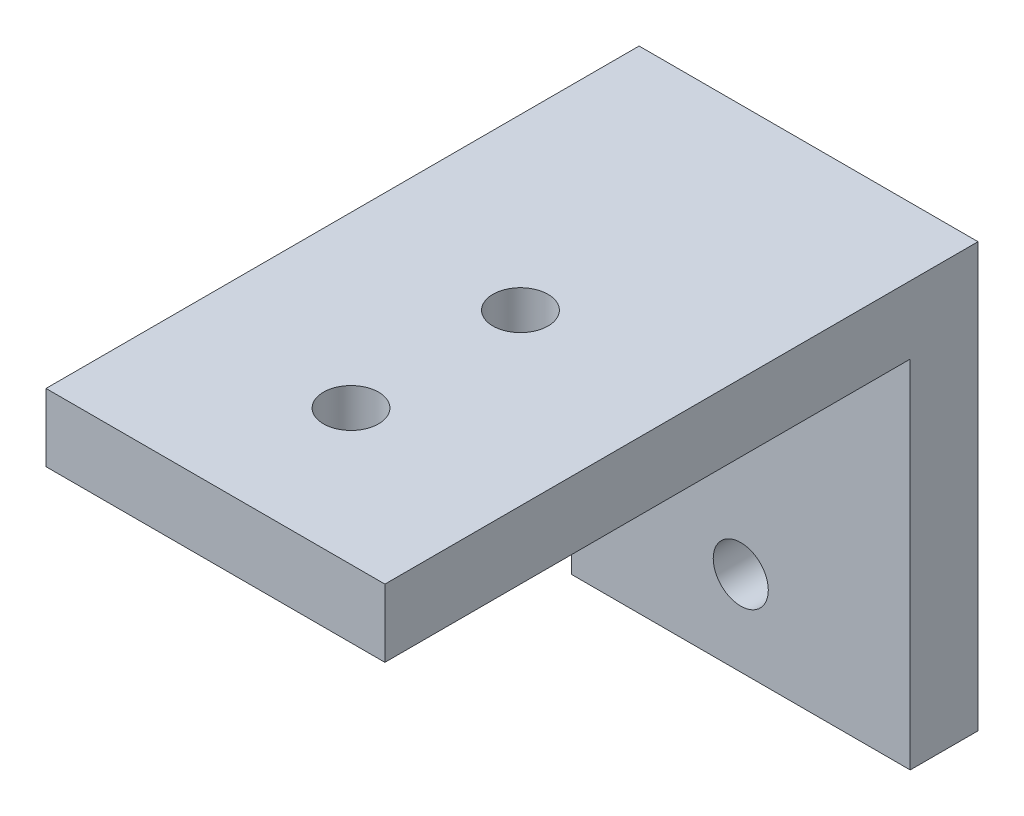
ISO-10303-21;
HEADER;
FILE_DESCRIPTION(('STEP AP214'),'2;1');
FILE_NAME('part.step','',(''),(''),'','','');
FILE_SCHEMA(('AUTOMOTIVE_DESIGN { 1 0 10303 214 1 1 1 1 }'));
ENDSEC;
DATA;
#1=APPLICATION_CONTEXT('core data for automotive mechanical design processes');
#2=APPLICATION_PROTOCOL_DEFINITION('international standard','automotive_design',2000,#1);
#3=PRODUCT_CONTEXT('',#1,'mechanical');
#4=PRODUCT('Part','Part','',(#3));
#5=PRODUCT_RELATED_PRODUCT_CATEGORY('part','',(#4));
#6=PRODUCT_DEFINITION_FORMATION('','',#4);
#7=PRODUCT_DEFINITION_CONTEXT('part definition',#1,'design');
#8=PRODUCT_DEFINITION('design','',#6,#7);
#9=PRODUCT_DEFINITION_SHAPE('','',#8);
#10=(LENGTH_UNIT() NAMED_UNIT(*) SI_UNIT(.MILLI.,.METRE.));
#11=(NAMED_UNIT(*) PLANE_ANGLE_UNIT() SI_UNIT($,.RADIAN.));
#12=(NAMED_UNIT(*) SI_UNIT($,.STERADIAN.) SOLID_ANGLE_UNIT());
#13=UNCERTAINTY_MEASURE_WITH_UNIT(LENGTH_MEASURE(1.E-05),#10,'distance_accuracy_value','');
#14=(GEOMETRIC_REPRESENTATION_CONTEXT(3) GLOBAL_UNCERTAINTY_ASSIGNED_CONTEXT((#13)) GLOBAL_UNIT_ASSIGNED_CONTEXT((#10,
#11,#12)) REPRESENTATION_CONTEXT('',''));
#15=CARTESIAN_POINT('',(0.,0.,0.));
#16=DIRECTION('',(0.,0.,1.));
#17=DIRECTION('',(1.,0.,0.));
#18=AXIS2_PLACEMENT_3D('',#15,#16,#17);
#19=CARTESIAN_POINT('',(0.,0.,8.));
#20=DIRECTION('',(0.,0.,1.));
#21=DIRECTION('',(1.,0.,0.));
#22=AXIS2_PLACEMENT_3D('',#19,#20,#21);
#23=PLANE('',#22);
#24=CARTESIAN_POINT('',(0.,-20.,8.));
#25=DIRECTION('',(0.,0.,1.));
#26=DIRECTION('',(1.,0.,0.));
#27=AXIS2_PLACEMENT_3D('',#24,#25,#26);
#28=CIRCLE('',#27,3.25);
#29=CARTESIAN_POINT('',(3.25,-20.,8.));
#30=VERTEX_POINT('',#29);
#31=EDGE_CURVE('E121',#30,#30,#28,.T.);
#32=ORIENTED_EDGE('',*,*,#31,.F.);
#33=EDGE_LOOP('',(#32));
#34=FACE_BOUND('',#33,.T.);
#35=CARTESIAN_POINT('',(0.,-40.,8.));
#36=DIRECTION('',(0.,0.,1.));
#37=DIRECTION('',(1.,0.,0.));
#38=AXIS2_PLACEMENT_3D('',#35,#36,#37);
#39=CIRCLE('',#38,3.25);
#40=CARTESIAN_POINT('',(3.25,-40.,8.));
#41=VERTEX_POINT('',#40);
#42=EDGE_CURVE('E288',#41,#41,#39,.T.);
#43=ORIENTED_EDGE('',*,*,#42,.F.);
#44=EDGE_LOOP('',(#43));
#45=FACE_BOUND('',#44,.T.);
#46=DIRECTION('',(0.,1.,0.));
#47=VECTOR('',#46,1.);
#48=CARTESIAN_POINT('',(20.,-50.,8.));
#49=LINE('',#48,#47);
#50=CARTESIAN_POINT('',(20.,-50.,8.));
#51=VERTEX_POINT('',#50);
#52=CARTESIAN_POINT('',(20.,-8.,8.));
#53=VERTEX_POINT('',#52);
#54=EDGE_CURVE('E63',#51,#53,#49,.T.);
#55=ORIENTED_EDGE('',*,*,#54,.T.);
#56=DIRECTION('',(-1.,0.,0.));
#57=VECTOR('',#56,1.);
#58=CARTESIAN_POINT('',(0.,-8.,8.));
#59=LINE('',#58,#57);
#60=CARTESIAN_POINT('',(-20.,-8.,8.));
#61=VERTEX_POINT('',#60);
#62=EDGE_CURVE('E67',#53,#61,#59,.T.);
#63=ORIENTED_EDGE('',*,*,#62,.T.);
#64=DIRECTION('',(0.,-1.,0.));
#65=VECTOR('',#64,1.);
#66=CARTESIAN_POINT('',(-20.,0.,8.));
#67=LINE('',#66,#65);
#68=CARTESIAN_POINT('',(-20.,-50.,8.));
#69=VERTEX_POINT('',#68);
#70=EDGE_CURVE('E124',#61,#69,#67,.T.);
#71=ORIENTED_EDGE('',*,*,#70,.T.);
#72=DIRECTION('',(1.,0.,0.));
#73=VECTOR('',#72,1.);
#74=CARTESIAN_POINT('',(-20.,-50.,8.));
#75=LINE('',#74,#73);
#76=EDGE_CURVE('E136',#69,#51,#75,.T.);
#77=ORIENTED_EDGE('',*,*,#76,.T.);
#78=EDGE_LOOP('',(#55,#63,#71,#77));
#79=FACE_BOUND('',#78,.T.);
#80=ADVANCED_FACE('F47',(#34,#45,#79),#23,.T.);
#81=CARTESIAN_POINT('',(-20.,0.,8.));
#82=DIRECTION('',(1.,0.,0.));
#83=DIRECTION('',(0.,0.,-1.));
#84=AXIS2_PLACEMENT_3D('',#81,#82,#83);
#85=PLANE('',#84);
#86=DIRECTION('',(0.,-1.,0.));
#87=VECTOR('',#86,1.);
#88=CARTESIAN_POINT('',(-20.,0.,0.));
#89=LINE('',#88,#87);
#90=CARTESIAN_POINT('',(-20.,0.,0.));
#91=VERTEX_POINT('',#90);
#92=CARTESIAN_POINT('',(-20.,-50.,0.));
#93=VERTEX_POINT('',#92);
#94=EDGE_CURVE('E129',#91,#93,#89,.T.);
#95=ORIENTED_EDGE('',*,*,#94,.T.);
#96=DIRECTION('',(0.,0.,-1.));
#97=VECTOR('',#96,1.);
#98=CARTESIAN_POINT('',(-20.,-50.,8.));
#99=LINE('',#98,#97);
#100=EDGE_CURVE('E11',#69,#93,#99,.T.);
#101=ORIENTED_EDGE('',*,*,#100,.F.);
#102=ORIENTED_EDGE('',*,*,#70,.F.);
#103=DIRECTION('',(0.,0.,-1.));
#104=VECTOR('',#103,1.);
#105=CARTESIAN_POINT('',(-20.,-8.,70.));
#106=LINE('',#105,#104);
#107=CARTESIAN_POINT('',(-20.,-8.,70.));
#108=VERTEX_POINT('',#107);
#109=EDGE_CURVE('E103',#108,#61,#106,.T.);
#110=ORIENTED_EDGE('',*,*,#109,.F.);
#111=DIRECTION('',(0.,-1.,0.));
#112=VECTOR('',#111,1.);
#113=CARTESIAN_POINT('',(-20.,0.,70.));
#114=LINE('',#113,#112);
#115=CARTESIAN_POINT('',(-20.,0.,70.));
#116=VERTEX_POINT('',#115);
#117=EDGE_CURVE('E111',#116,#108,#114,.T.);
#118=ORIENTED_EDGE('',*,*,#117,.F.);
#119=DIRECTION('',(0.,0.,-1.));
#120=VECTOR('',#119,1.);
#121=CARTESIAN_POINT('',(-20.,0.,8.));
#122=LINE('',#121,#120);
#123=EDGE_CURVE('E142',#116,#91,#122,.T.);
#124=ORIENTED_EDGE('',*,*,#123,.T.);
#125=EDGE_LOOP('',(#95,#101,#102,#110,#118,#124));
#126=FACE_BOUND('',#125,.T.);
#127=ADVANCED_FACE('F49',(#126),#85,.F.);
#128=CARTESIAN_POINT('',(-20.,-50.,8.));
#129=DIRECTION('',(0.,1.,0.));
#130=DIRECTION('',(0.,0.,1.));
#131=AXIS2_PLACEMENT_3D('',#128,#129,#130);
#132=PLANE('',#131);
#133=DIRECTION('',(1.,0.,0.));
#134=VECTOR('',#133,1.);
#135=CARTESIAN_POINT('',(-20.,-50.,0.));
#136=LINE('',#135,#134);
#137=CARTESIAN_POINT('',(20.,-50.,0.));
#138=VERTEX_POINT('',#137);
#139=EDGE_CURVE('E145',#93,#138,#136,.T.);
#140=ORIENTED_EDGE('',*,*,#139,.T.);
#141=DIRECTION('',(0.,0.,-1.));
#142=VECTOR('',#141,1.);
#143=CARTESIAN_POINT('',(20.,-50.,8.));
#144=LINE('',#143,#142);
#145=EDGE_CURVE('E56',#51,#138,#144,.T.);
#146=ORIENTED_EDGE('',*,*,#145,.F.);
#147=ORIENTED_EDGE('',*,*,#76,.F.);
#148=ORIENTED_EDGE('',*,*,#100,.T.);
#149=EDGE_LOOP('',(#140,#146,#147,#148));
#150=FACE_BOUND('',#149,.T.);
#151=ADVANCED_FACE('F173',(#150),#132,.F.);
#152=CARTESIAN_POINT('',(20.,-50.,8.));
#153=DIRECTION('',(-1.,0.,0.));
#154=DIRECTION('',(0.,0.,1.));
#155=AXIS2_PLACEMENT_3D('',#152,#153,#154);
#156=PLANE('',#155);
#157=DIRECTION('',(0.,0.,-1.));
#158=VECTOR('',#157,1.);
#159=CARTESIAN_POINT('',(20.,0.,8.));
#160=LINE('',#159,#158);
#161=CARTESIAN_POINT('',(20.,0.,70.));
#162=VERTEX_POINT('',#161);
#163=CARTESIAN_POINT('',(20.,0.,0.));
#164=VERTEX_POINT('',#163);
#165=EDGE_CURVE('E155',#162,#164,#160,.T.);
#166=ORIENTED_EDGE('',*,*,#165,.F.);
#167=DIRECTION('',(0.,1.,0.));
#168=VECTOR('',#167,1.);
#169=CARTESIAN_POINT('',(20.,-8.,70.));
#170=LINE('',#169,#168);
#171=CARTESIAN_POINT('',(20.,-8.,70.));
#172=VERTEX_POINT('',#171);
#173=EDGE_CURVE('E110',#172,#162,#170,.T.);
#174=ORIENTED_EDGE('',*,*,#173,.F.);
#175=DIRECTION('',(0.,0.,-1.));
#176=VECTOR('',#175,1.);
#177=CARTESIAN_POINT('',(20.,-8.,70.));
#178=LINE('',#177,#176);
#179=EDGE_CURVE('E105',#172,#53,#178,.T.);
#180=ORIENTED_EDGE('',*,*,#179,.T.);
#181=ORIENTED_EDGE('',*,*,#54,.F.);
#182=ORIENTED_EDGE('',*,*,#145,.T.);
#183=DIRECTION('',(0.,1.,0.));
#184=VECTOR('',#183,1.);
#185=CARTESIAN_POINT('',(20.,-50.,0.));
#186=LINE('',#185,#184);
#187=EDGE_CURVE('E148',#138,#164,#186,.T.);
#188=ORIENTED_EDGE('',*,*,#187,.T.);
#189=EDGE_LOOP('',(#166,#174,#180,#181,#182,#188));
#190=FACE_BOUND('',#189,.T.);
#191=ADVANCED_FACE('F163',(#190),#156,.F.);
#192=CARTESIAN_POINT('',(20.,0.,8.));
#193=DIRECTION('',(0.,-1.,0.));
#194=DIRECTION('',(0.,0.,-1.));
#195=AXIS2_PLACEMENT_3D('',#192,#193,#194);
#196=PLANE('',#195);
#197=CARTESIAN_POINT('',(0.,0.,34.));
#198=DIRECTION('',(0.,-1.,0.));
#199=DIRECTION('',(0.,0.,-1.));
#200=AXIS2_PLACEMENT_3D('',#197,#198,#199);
#201=CIRCLE('',#200,3.25);
#202=CARTESIAN_POINT('',(0.,0.,30.75));
#203=VERTEX_POINT('',#202);
#204=EDGE_CURVE('E265',#203,#203,#201,.T.);
#205=ORIENTED_EDGE('',*,*,#204,.T.);
#206=EDGE_LOOP('',(#205));
#207=FACE_BOUND('',#206,.T.);
#208=CARTESIAN_POINT('',(0.,0.,54.));
#209=DIRECTION('',(0.,-1.,0.));
#210=DIRECTION('',(0.,0.,-1.));
#211=AXIS2_PLACEMENT_3D('',#208,#209,#210);
#212=CIRCLE('',#211,3.25);
#213=CARTESIAN_POINT('',(0.,0.,50.75));
#214=VERTEX_POINT('',#213);
#215=EDGE_CURVE('E278',#214,#214,#212,.T.);
#216=ORIENTED_EDGE('',*,*,#215,.T.);
#217=EDGE_LOOP('',(#216));
#218=FACE_BOUND('',#217,.T.);
#219=DIRECTION('',(-1.,0.,0.));
#220=VECTOR('',#219,1.);
#221=CARTESIAN_POINT('',(20.,0.,0.));
#222=LINE('',#221,#220);
#223=EDGE_CURVE('E137',#164,#91,#222,.T.);
#224=ORIENTED_EDGE('',*,*,#223,.T.);
#225=ORIENTED_EDGE('',*,*,#123,.F.);
#226=DIRECTION('',(-1.,0.,0.));
#227=VECTOR('',#226,1.);
#228=CARTESIAN_POINT('',(20.,0.,70.));
#229=LINE('',#228,#227);
#230=EDGE_CURVE('E117',#162,#116,#229,.T.);
#231=ORIENTED_EDGE('',*,*,#230,.F.);
#232=ORIENTED_EDGE('',*,*,#165,.T.);
#233=EDGE_LOOP('',(#224,#225,#231,#232));
#234=FACE_BOUND('',#233,.T.);
#235=ADVANCED_FACE('F172',(#207,#218,#234),#196,.F.);
#236=CARTESIAN_POINT('',(0.,0.,0.));
#237=DIRECTION('',(0.,0.,1.));
#238=DIRECTION('',(1.,0.,0.));
#239=AXIS2_PLACEMENT_3D('',#236,#237,#238);
#240=PLANE('',#239);
#241=CARTESIAN_POINT('',(0.,-20.,0.));
#242=DIRECTION('',(0.,0.,-1.));
#243=DIRECTION('',(-1.,0.,0.));
#244=AXIS2_PLACEMENT_3D('',#241,#242,#243);
#245=CIRCLE('',#244,3.25);
#246=CARTESIAN_POINT('',(-3.25,-20.,0.));
#247=VERTEX_POINT('',#246);
#248=EDGE_CURVE('E284',#247,#247,#245,.T.);
#249=ORIENTED_EDGE('',*,*,#248,.F.);
#250=EDGE_LOOP('',(#249));
#251=FACE_BOUND('',#250,.T.);
#252=CARTESIAN_POINT('',(0.,-40.,0.));
#253=DIRECTION('',(0.,0.,-1.));
#254=DIRECTION('',(-1.,0.,0.));
#255=AXIS2_PLACEMENT_3D('',#252,#253,#254);
#256=CIRCLE('',#255,3.25);
#257=CARTESIAN_POINT('',(-3.25,-40.,0.));
#258=VERTEX_POINT('',#257);
#259=EDGE_CURVE('E275',#258,#258,#256,.T.);
#260=ORIENTED_EDGE('',*,*,#259,.F.);
#261=EDGE_LOOP('',(#260));
#262=FACE_BOUND('',#261,.T.);
#263=ORIENTED_EDGE('',*,*,#223,.F.);
#264=ORIENTED_EDGE('',*,*,#187,.F.);
#265=ORIENTED_EDGE('',*,*,#139,.F.);
#266=ORIENTED_EDGE('',*,*,#94,.F.);
#267=EDGE_LOOP('',(#263,#264,#265,#266));
#268=FACE_BOUND('',#267,.T.);
#269=ADVANCED_FACE('F169',(#251,#262,#268),#240,.F.);
#270=CARTESIAN_POINT('',(-20.,-8.,70.));
#271=DIRECTION('',(0.,1.,0.));
#272=DIRECTION('',(0.,0.,1.));
#273=AXIS2_PLACEMENT_3D('',#270,#271,#272);
#274=PLANE('',#273);
#275=CARTESIAN_POINT('',(0.,-8.,34.));
#276=DIRECTION('',(0.,-1.,0.));
#277=DIRECTION('',(0.,0.,-1.));
#278=AXIS2_PLACEMENT_3D('',#275,#276,#277);
#279=CIRCLE('',#278,3.25);
#280=CARTESIAN_POINT('',(0.,-8.,30.75));
#281=VERTEX_POINT('',#280);
#282=EDGE_CURVE('E268',#281,#281,#279,.T.);
#283=ORIENTED_EDGE('',*,*,#282,.F.);
#284=EDGE_LOOP('',(#283));
#285=FACE_BOUND('',#284,.T.);
#286=CARTESIAN_POINT('',(0.,-8.,54.));
#287=DIRECTION('',(0.,-1.,0.));
#288=DIRECTION('',(0.,0.,-1.));
#289=AXIS2_PLACEMENT_3D('',#286,#287,#288);
#290=CIRCLE('',#289,3.25);
#291=CARTESIAN_POINT('',(0.,-8.,50.75));
#292=VERTEX_POINT('',#291);
#293=EDGE_CURVE('E271',#292,#292,#290,.T.);
#294=ORIENTED_EDGE('',*,*,#293,.F.);
#295=EDGE_LOOP('',(#294));
#296=FACE_BOUND('',#295,.T.);
#297=ORIENTED_EDGE('',*,*,#62,.F.);
#298=ORIENTED_EDGE('',*,*,#179,.F.);
#299=DIRECTION('',(1.,0.,0.));
#300=VECTOR('',#299,1.);
#301=CARTESIAN_POINT('',(-20.,-8.,70.));
#302=LINE('',#301,#300);
#303=EDGE_CURVE('E99',#108,#172,#302,.T.);
#304=ORIENTED_EDGE('',*,*,#303,.F.);
#305=ORIENTED_EDGE('',*,*,#109,.T.);
#306=EDGE_LOOP('',(#297,#298,#304,#305));
#307=FACE_BOUND('',#306,.T.);
#308=ADVANCED_FACE('F101',(#285,#296,#307),#274,.F.);
#309=CARTESIAN_POINT('',(0.,0.,70.));
#310=DIRECTION('',(0.,0.,1.));
#311=DIRECTION('',(1.,0.,0.));
#312=AXIS2_PLACEMENT_3D('',#309,#310,#311);
#313=PLANE('',#312);
#314=ORIENTED_EDGE('',*,*,#117,.T.);
#315=ORIENTED_EDGE('',*,*,#303,.T.);
#316=ORIENTED_EDGE('',*,*,#173,.T.);
#317=ORIENTED_EDGE('',*,*,#230,.T.);
#318=EDGE_LOOP('',(#314,#315,#316,#317));
#319=FACE_BOUND('',#318,.T.);
#320=ADVANCED_FACE('F115',(#319),#313,.T.);
#321=CARTESIAN_POINT('',(0.,-40.,9.));
#322=DIRECTION('',(0.,0.,-1.));
#323=DIRECTION('',(-1.,0.,0.));
#324=AXIS2_PLACEMENT_3D('',#321,#322,#323);
#325=CYLINDRICAL_SURFACE('',#324,3.25);
#326=ORIENTED_EDGE('',*,*,#42,.T.);
#327=EDGE_LOOP('',(#326));
#328=FACE_BOUND('',#327,.T.);
#329=ORIENTED_EDGE('',*,*,#259,.T.);
#330=EDGE_LOOP('',(#329));
#331=FACE_BOUND('',#330,.T.);
#332=ADVANCED_FACE('F213',(#328,#331),#325,.F.);
#333=CARTESIAN_POINT('',(0.,-20.,9.));
#334=DIRECTION('',(0.,0.,-1.));
#335=DIRECTION('',(-1.,0.,0.));
#336=AXIS2_PLACEMENT_3D('',#333,#334,#335);
#337=CYLINDRICAL_SURFACE('',#336,3.25);
#338=ORIENTED_EDGE('',*,*,#31,.T.);
#339=EDGE_LOOP('',(#338));
#340=FACE_BOUND('',#339,.T.);
#341=ORIENTED_EDGE('',*,*,#248,.T.);
#342=EDGE_LOOP('',(#341));
#343=FACE_BOUND('',#342,.T.);
#344=ADVANCED_FACE('F229',(#340,#343),#337,.F.);
#345=CARTESIAN_POINT('',(0.,0.,54.));
#346=DIRECTION('',(0.,-1.,0.));
#347=DIRECTION('',(0.,0.,-1.));
#348=AXIS2_PLACEMENT_3D('',#345,#346,#347);
#349=CYLINDRICAL_SURFACE('',#348,3.25);
#350=ORIENTED_EDGE('',*,*,#215,.F.);
#351=EDGE_LOOP('',(#350));
#352=FACE_BOUND('',#351,.T.);
#353=ORIENTED_EDGE('',*,*,#293,.T.);
#354=EDGE_LOOP('',(#353));
#355=FACE_BOUND('',#354,.T.);
#356=ADVANCED_FACE('F239',(#352,#355),#349,.F.);
#357=CARTESIAN_POINT('',(0.,0.,34.));
#358=DIRECTION('',(0.,-1.,0.));
#359=DIRECTION('',(0.,0.,-1.));
#360=AXIS2_PLACEMENT_3D('',#357,#358,#359);
#361=CYLINDRICAL_SURFACE('',#360,3.25);
#362=ORIENTED_EDGE('',*,*,#204,.F.);
#363=EDGE_LOOP('',(#362));
#364=FACE_BOUND('',#363,.T.);
#365=ORIENTED_EDGE('',*,*,#282,.T.);
#366=EDGE_LOOP('',(#365));
#367=FACE_BOUND('',#366,.T.);
#368=ADVANCED_FACE('F249',(#364,#367),#361,.F.);
#369=CLOSED_SHELL('',(#80,#127,#151,#191,#235,#269,#308,#320,#332,#344,#356,#368));
#370=MANIFOLD_SOLID_BREP('B2',#369);
#371=ADVANCED_BREP_SHAPE_REPRESENTATION('',(#18,#370),#14);
#372=SHAPE_DEFINITION_REPRESENTATION(#9,#371);
ENDSEC;
END-ISO-10303-21;
